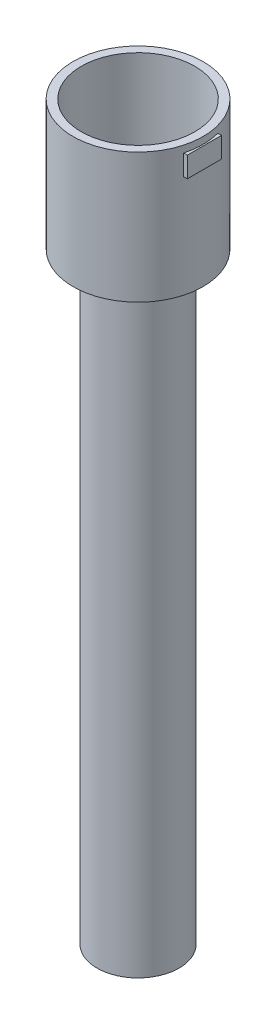
ISO-10303-21;
HEADER;
FILE_DESCRIPTION(('STEP AP214'),'2;1');
FILE_NAME('part.step','',(''),(''),'','','');
FILE_SCHEMA(('AUTOMOTIVE_DESIGN { 1 0 10303 214 1 1 1 1 }'));
ENDSEC;
DATA;
#1=APPLICATION_CONTEXT('core data for automotive mechanical design processes');
#2=APPLICATION_PROTOCOL_DEFINITION('international standard','automotive_design',2000,#1);
#3=PRODUCT_CONTEXT('',#1,'mechanical');
#4=PRODUCT('Part','Part','',(#3));
#5=PRODUCT_RELATED_PRODUCT_CATEGORY('part','',(#4));
#6=PRODUCT_DEFINITION_FORMATION('','',#4);
#7=PRODUCT_DEFINITION_CONTEXT('part definition',#1,'design');
#8=PRODUCT_DEFINITION('design','',#6,#7);
#9=PRODUCT_DEFINITION_SHAPE('','',#8);
#10=(LENGTH_UNIT() NAMED_UNIT(*) SI_UNIT(.MILLI.,.METRE.));
#11=(NAMED_UNIT(*) PLANE_ANGLE_UNIT() SI_UNIT($,.RADIAN.));
#12=(NAMED_UNIT(*) SI_UNIT($,.STERADIAN.) SOLID_ANGLE_UNIT());
#13=UNCERTAINTY_MEASURE_WITH_UNIT(LENGTH_MEASURE(1.E-05),#10,'distance_accuracy_value','');
#14=(GEOMETRIC_REPRESENTATION_CONTEXT(3) GLOBAL_UNCERTAINTY_ASSIGNED_CONTEXT((#13)) GLOBAL_UNIT_ASSIGNED_CONTEXT((#10,
#11,#12)) REPRESENTATION_CONTEXT('',''));
#15=CARTESIAN_POINT('',(0.,0.,0.));
#16=DIRECTION('',(0.,0.,1.));
#17=DIRECTION('',(1.,0.,0.));
#18=AXIS2_PLACEMENT_3D('',#15,#16,#17);
#19=CARTESIAN_POINT('',(0.,0.,0.));
#20=DIRECTION('',(0.,-1.,0.));
#21=DIRECTION('',(0.,0.,-1.));
#22=AXIS2_PLACEMENT_3D('',#19,#20,#21);
#23=PLANE('',#22);
#24=CARTESIAN_POINT('',(0.,0.,0.));
#25=DIRECTION('',(0.,-1.,0.));
#26=DIRECTION('',(0.,0.,-1.));
#27=AXIS2_PLACEMENT_3D('',#24,#25,#26);
#28=CIRCLE('',#27,6.);
#29=CARTESIAN_POINT('',(0.,0.,-6.));
#30=VERTEX_POINT('',#29);
#31=EDGE_CURVE('E11',#30,#30,#28,.T.);
#32=ORIENTED_EDGE('',*,*,#31,.T.);
#33=EDGE_LOOP('',(#32));
#34=FACE_BOUND('',#33,.T.);
#35=ADVANCED_FACE('F39',(#34),#23,.T.);
#36=CARTESIAN_POINT('',(0.,0.,0.));
#37=DIRECTION('',(0.,-1.,0.));
#38=DIRECTION('',(0.,0.,-1.));
#39=AXIS2_PLACEMENT_3D('',#36,#37,#38);
#40=CYLINDRICAL_SURFACE('',#39,6.);
#41=CARTESIAN_POINT('',(0.,88.,0.));
#42=DIRECTION('',(0.,-1.,0.));
#43=DIRECTION('',(0.,0.,-1.));
#44=AXIS2_PLACEMENT_3D('',#41,#42,#43);
#45=CIRCLE('',#44,6.);
#46=CARTESIAN_POINT('',(0.,88.,-6.));
#47=VERTEX_POINT('',#46);
#48=EDGE_CURVE('E46',#47,#47,#45,.T.);
#49=ORIENTED_EDGE('',*,*,#48,.T.);
#50=EDGE_LOOP('',(#49));
#51=FACE_BOUND('',#50,.T.);
#52=ORIENTED_EDGE('',*,*,#31,.F.);
#53=EDGE_LOOP('',(#52));
#54=FACE_BOUND('',#53,.T.);
#55=ADVANCED_FACE('F167',(#51,#54),#40,.T.);
#56=CARTESIAN_POINT('',(6.,88.,0.));
#57=DIRECTION('',(0.,-1.,0.));
#58=DIRECTION('',(0.,0.,-1.));
#59=AXIS2_PLACEMENT_3D('',#56,#57,#58);
#60=PLANE('',#59);
#61=CARTESIAN_POINT('',(0.,88.,0.));
#62=DIRECTION('',(0.,-1.,0.));
#63=DIRECTION('',(0.,0.,-1.));
#64=AXIS2_PLACEMENT_3D('',#61,#62,#63);
#65=CIRCLE('',#64,9.5);
#66=CARTESIAN_POINT('',(0.,88.,-9.5));
#67=VERTEX_POINT('',#66);
#68=EDGE_CURVE('E162',#67,#67,#65,.T.);
#69=ORIENTED_EDGE('',*,*,#68,.T.);
#70=EDGE_LOOP('',(#69));
#71=FACE_BOUND('',#70,.T.);
#72=ORIENTED_EDGE('',*,*,#48,.F.);
#73=EDGE_LOOP('',(#72));
#74=FACE_BOUND('',#73,.T.);
#75=ADVANCED_FACE('F170',(#71,#74),#60,.T.);
#76=CARTESIAN_POINT('',(0.,0.,0.));
#77=DIRECTION('',(0.,-1.,0.));
#78=DIRECTION('',(0.,0.,-1.));
#79=AXIS2_PLACEMENT_3D('',#76,#77,#78);
#80=CYLINDRICAL_SURFACE('',#79,9.5);
#81=DIRECTION('',(0.,-1.,0.));
#82=VECTOR('',#81,1.);
#83=CARTESIAN_POINT('',(-9.16515138991168,0.,2.5));
#84=LINE('',#83,#82);
#85=CARTESIAN_POINT('',(-9.16515138991168,103.,2.5));
#86=VERTEX_POINT('',#85);
#87=CARTESIAN_POINT('',(-9.16515138991168,106.,2.5));
#88=VERTEX_POINT('',#87);
#89=EDGE_CURVE('E144',#86,#88,#84,.F.);
#90=ORIENTED_EDGE('',*,*,#89,.F.);
#91=CARTESIAN_POINT('',(0.,103.,0.));
#92=DIRECTION('',(0.,1.,0.));
#93=DIRECTION('',(0.,0.,1.));
#94=AXIS2_PLACEMENT_3D('',#91,#92,#93);
#95=CIRCLE('',#94,9.5);
#96=CARTESIAN_POINT('',(-9.16515138991168,103.,-2.5));
#97=VERTEX_POINT('',#96);
#98=EDGE_CURVE('E111',#86,#97,#95,.F.);
#99=ORIENTED_EDGE('',*,*,#98,.T.);
#100=DIRECTION('',(0.,-1.,0.));
#101=VECTOR('',#100,1.);
#102=CARTESIAN_POINT('',(-9.16515138991168,0.,-2.5));
#103=LINE('',#102,#101);
#104=CARTESIAN_POINT('',(-9.16515138991168,106.,-2.5));
#105=VERTEX_POINT('',#104);
#106=EDGE_CURVE('E133',#97,#105,#103,.F.);
#107=ORIENTED_EDGE('',*,*,#106,.T.);
#108=CARTESIAN_POINT('',(0.,106.,0.));
#109=DIRECTION('',(0.,-1.,0.));
#110=DIRECTION('',(0.,0.,-1.));
#111=AXIS2_PLACEMENT_3D('',#108,#109,#110);
#112=CIRCLE('',#111,9.5);
#113=EDGE_CURVE('E149',#105,#88,#112,.F.);
#114=ORIENTED_EDGE('',*,*,#113,.T.);
#115=EDGE_LOOP('',(#90,#99,#107,#114));
#116=FACE_BOUND('',#115,.T.);
#117=DIRECTION('',(0.,-1.,0.));
#118=VECTOR('',#117,1.);
#119=CARTESIAN_POINT('',(9.16515138991168,0.,2.5));
#120=LINE('',#119,#118);
#121=CARTESIAN_POINT('',(9.16515138991168,106.,2.5));
#122=VERTEX_POINT('',#121);
#123=CARTESIAN_POINT('',(9.16515138991168,103.,2.5));
#124=VERTEX_POINT('',#123);
#125=EDGE_CURVE('E142',#122,#124,#120,.T.);
#126=ORIENTED_EDGE('',*,*,#125,.F.);
#127=CARTESIAN_POINT('',(9.16515138991168,106.,-2.5));
#128=VERTEX_POINT('',#127);
#129=EDGE_CURVE('E146',#122,#128,#112,.F.);
#130=ORIENTED_EDGE('',*,*,#129,.T.);
#131=DIRECTION('',(0.,-1.,0.));
#132=VECTOR('',#131,1.);
#133=CARTESIAN_POINT('',(9.16515138991168,0.,-2.5));
#134=LINE('',#133,#132);
#135=CARTESIAN_POINT('',(9.16515138991168,103.,-2.5));
#136=VERTEX_POINT('',#135);
#137=EDGE_CURVE('E129',#128,#136,#134,.T.);
#138=ORIENTED_EDGE('',*,*,#137,.T.);
#139=EDGE_CURVE('E150',#136,#124,#95,.F.);
#140=ORIENTED_EDGE('',*,*,#139,.T.);
#141=EDGE_LOOP('',(#126,#130,#138,#140));
#142=FACE_BOUND('',#141,.T.);
#143=CARTESIAN_POINT('',(0.,107.,0.));
#144=DIRECTION('',(0.,-1.,0.));
#145=DIRECTION('',(0.,0.,-1.));
#146=AXIS2_PLACEMENT_3D('',#143,#144,#145);
#147=CIRCLE('',#146,9.5);
#148=CARTESIAN_POINT('',(0.,107.,-9.5));
#149=VERTEX_POINT('',#148);
#150=EDGE_CURVE('E159',#149,#149,#147,.T.);
#151=ORIENTED_EDGE('',*,*,#150,.T.);
#152=EDGE_LOOP('',(#151));
#153=FACE_BOUND('',#152,.T.);
#154=ORIENTED_EDGE('',*,*,#68,.F.);
#155=EDGE_LOOP('',(#154));
#156=FACE_BOUND('',#155,.T.);
#157=ADVANCED_FACE('F172',(#116,#142,#153,#156),#80,.T.);
#158=CARTESIAN_POINT('',(9.5,107.,0.));
#159=DIRECTION('',(0.,1.,0.));
#160=DIRECTION('',(0.,0.,1.));
#161=AXIS2_PLACEMENT_3D('',#158,#159,#160);
#162=PLANE('',#161);
#163=CARTESIAN_POINT('',(0.,107.,0.));
#164=DIRECTION('',(0.,-1.,0.));
#165=DIRECTION('',(0.,0.,-1.));
#166=AXIS2_PLACEMENT_3D('',#163,#164,#165);
#167=CIRCLE('',#166,8.3);
#168=CARTESIAN_POINT('',(0.,107.,-8.3));
#169=VERTEX_POINT('',#168);
#170=EDGE_CURVE('E156',#169,#169,#167,.T.);
#171=ORIENTED_EDGE('',*,*,#170,.T.);
#172=EDGE_LOOP('',(#171));
#173=FACE_BOUND('',#172,.T.);
#174=ORIENTED_EDGE('',*,*,#150,.F.);
#175=EDGE_LOOP('',(#174));
#176=FACE_BOUND('',#175,.T.);
#177=ADVANCED_FACE('F179',(#173,#176),#162,.T.);
#178=CARTESIAN_POINT('',(0.,0.,0.));
#179=DIRECTION('',(0.,-1.,0.));
#180=DIRECTION('',(0.,0.,-1.));
#181=AXIS2_PLACEMENT_3D('',#178,#179,#180);
#182=CYLINDRICAL_SURFACE('',#181,8.3);
#183=CARTESIAN_POINT('',(0.,89.,0.));
#184=DIRECTION('',(0.,-1.,0.));
#185=DIRECTION('',(0.,0.,-1.));
#186=AXIS2_PLACEMENT_3D('',#183,#184,#185);
#187=CIRCLE('',#186,8.3);
#188=CARTESIAN_POINT('',(0.,89.,-8.3));
#189=VERTEX_POINT('',#188);
#190=EDGE_CURVE('E153',#189,#189,#187,.T.);
#191=ORIENTED_EDGE('',*,*,#190,.T.);
#192=EDGE_LOOP('',(#191));
#193=FACE_BOUND('',#192,.T.);
#194=ORIENTED_EDGE('',*,*,#170,.F.);
#195=EDGE_LOOP('',(#194));
#196=FACE_BOUND('',#195,.T.);
#197=ADVANCED_FACE('F207',(#193,#196),#182,.F.);
#198=CARTESIAN_POINT('',(8.3,89.,0.));
#199=DIRECTION('',(0.,1.,0.));
#200=DIRECTION('',(0.,0.,1.));
#201=AXIS2_PLACEMENT_3D('',#198,#199,#200);
#202=PLANE('',#201);
#203=ORIENTED_EDGE('',*,*,#190,.F.);
#204=EDGE_LOOP('',(#203));
#205=FACE_BOUND('',#204,.T.);
#206=ADVANCED_FACE('F216',(#205),#202,.T.);
#207=CARTESIAN_POINT('',(9.7,103.,2.5));
#208=DIRECTION('',(-1.,0.,0.));
#209=DIRECTION('',(0.,0.,1.));
#210=AXIS2_PLACEMENT_3D('',#207,#208,#209);
#211=PLANE('',#210);
#212=DIRECTION('',(0.,1.,0.));
#213=VECTOR('',#212,1.);
#214=CARTESIAN_POINT('',(9.7,103.,-2.5));
#215=LINE('',#214,#213);
#216=CARTESIAN_POINT('',(9.7,103.,-2.5));
#217=VERTEX_POINT('',#216);
#218=CARTESIAN_POINT('',(9.7,106.,-2.5));
#219=VERTEX_POINT('',#218);
#220=EDGE_CURVE('E371',#217,#219,#215,.T.);
#221=ORIENTED_EDGE('',*,*,#220,.T.);
#222=DIRECTION('',(0.,0.,-1.));
#223=VECTOR('',#222,1.);
#224=CARTESIAN_POINT('',(9.7,106.,2.5));
#225=LINE('',#224,#223);
#226=CARTESIAN_POINT('',(9.7,106.,2.5));
#227=VERTEX_POINT('',#226);
#228=EDGE_CURVE('E136',#227,#219,#225,.T.);
#229=ORIENTED_EDGE('',*,*,#228,.F.);
#230=DIRECTION('',(0.,1.,0.));
#231=VECTOR('',#230,1.);
#232=CARTESIAN_POINT('',(9.7,103.,2.5));
#233=LINE('',#232,#231);
#234=CARTESIAN_POINT('',(9.7,103.,2.5));
#235=VERTEX_POINT('',#234);
#236=EDGE_CURVE('E114',#235,#227,#233,.T.);
#237=ORIENTED_EDGE('',*,*,#236,.F.);
#238=DIRECTION('',(0.,0.,-1.));
#239=VECTOR('',#238,1.);
#240=CARTESIAN_POINT('',(9.7,103.,2.5));
#241=LINE('',#240,#239);
#242=EDGE_CURVE('E130',#235,#217,#241,.T.);
#243=ORIENTED_EDGE('',*,*,#242,.T.);
#244=EDGE_LOOP('',(#221,#229,#237,#243));
#245=FACE_BOUND('',#244,.T.);
#246=ADVANCED_FACE('F221',(#245),#211,.F.);
#247=CARTESIAN_POINT('',(0.,0.,-2.5));
#248=DIRECTION('',(0.,0.,1.));
#249=DIRECTION('',(1.,0.,0.));
#250=AXIS2_PLACEMENT_3D('',#247,#248,#249);
#251=PLANE('',#250);
#252=ORIENTED_EDGE('',*,*,#137,.F.);
#253=DIRECTION('',(-1.,0.,0.));
#254=VECTOR('',#253,1.);
#255=CARTESIAN_POINT('',(9.7,106.,-2.5));
#256=LINE('',#255,#254);
#257=EDGE_CURVE('E125',#219,#128,#256,.T.);
#258=ORIENTED_EDGE('',*,*,#257,.F.);
#259=ORIENTED_EDGE('',*,*,#220,.F.);
#260=DIRECTION('',(1.,0.,0.));
#261=VECTOR('',#260,1.);
#262=CARTESIAN_POINT('',(-9.7,103.,-2.5));
#263=LINE('',#262,#261);
#264=EDGE_CURVE('E61',#136,#217,#263,.T.);
#265=ORIENTED_EDGE('',*,*,#264,.F.);
#266=EDGE_LOOP('',(#252,#258,#259,#265));
#267=FACE_BOUND('',#266,.T.);
#268=ADVANCED_FACE('F238',(#267),#251,.F.);
#269=CARTESIAN_POINT('',(0.,0.,2.5));
#270=DIRECTION('',(0.,0.,1.));
#271=DIRECTION('',(1.,0.,0.));
#272=AXIS2_PLACEMENT_3D('',#269,#270,#271);
#273=PLANE('',#272);
#274=DIRECTION('',(-1.,0.,0.));
#275=VECTOR('',#274,1.);
#276=CARTESIAN_POINT('',(9.7,106.,2.5));
#277=LINE('',#276,#275);
#278=EDGE_CURVE('E375',#227,#122,#277,.T.);
#279=ORIENTED_EDGE('',*,*,#278,.T.);
#280=ORIENTED_EDGE('',*,*,#125,.T.);
#281=DIRECTION('',(1.,0.,0.));
#282=VECTOR('',#281,1.);
#283=CARTESIAN_POINT('',(-9.7,103.,2.5));
#284=LINE('',#283,#282);
#285=EDGE_CURVE('E115',#124,#235,#284,.T.);
#286=ORIENTED_EDGE('',*,*,#285,.T.);
#287=ORIENTED_EDGE('',*,*,#236,.T.);
#288=EDGE_LOOP('',(#279,#280,#286,#287));
#289=FACE_BOUND('',#288,.T.);
#290=ADVANCED_FACE('F249',(#289),#273,.T.);
#291=CARTESIAN_POINT('',(9.7,106.,2.5));
#292=DIRECTION('',(0.,-1.,0.));
#293=DIRECTION('',(0.,0.,-1.));
#294=AXIS2_PLACEMENT_3D('',#291,#292,#293);
#295=PLANE('',#294);
#296=ORIENTED_EDGE('',*,*,#129,.F.);
#297=ORIENTED_EDGE('',*,*,#278,.F.);
#298=ORIENTED_EDGE('',*,*,#228,.T.);
#299=ORIENTED_EDGE('',*,*,#257,.T.);
#300=EDGE_LOOP('',(#296,#297,#298,#299));
#301=FACE_BOUND('',#300,.T.);
#302=ADVANCED_FACE('F260',(#301),#295,.F.);
#303=CARTESIAN_POINT('',(-9.7,103.,2.5));
#304=DIRECTION('',(0.,1.,0.));
#305=DIRECTION('',(0.,0.,1.));
#306=AXIS2_PLACEMENT_3D('',#303,#304,#305);
#307=PLANE('',#306);
#308=ORIENTED_EDGE('',*,*,#139,.F.);
#309=ORIENTED_EDGE('',*,*,#264,.T.);
#310=ORIENTED_EDGE('',*,*,#242,.F.);
#311=ORIENTED_EDGE('',*,*,#285,.F.);
#312=EDGE_LOOP('',(#308,#309,#310,#311));
#313=FACE_BOUND('',#312,.T.);
#314=ADVANCED_FACE('F271',(#313),#307,.F.);
#315=ORIENTED_EDGE('',*,*,#98,.F.);
#316=CARTESIAN_POINT('',(-9.7,103.,2.5));
#317=VERTEX_POINT('',#316);
#318=EDGE_CURVE('E103',#317,#86,#284,.T.);
#319=ORIENTED_EDGE('',*,*,#318,.F.);
#320=DIRECTION('',(0.,0.,-1.));
#321=VECTOR('',#320,1.);
#322=CARTESIAN_POINT('',(-9.7,103.,2.5));
#323=LINE('',#322,#321);
#324=CARTESIAN_POINT('',(-9.7,103.,-2.5));
#325=VERTEX_POINT('',#324);
#326=EDGE_CURVE('E108',#317,#325,#323,.T.);
#327=ORIENTED_EDGE('',*,*,#326,.T.);
#328=EDGE_CURVE('E369',#325,#97,#263,.T.);
#329=ORIENTED_EDGE('',*,*,#328,.T.);
#330=EDGE_LOOP('',(#315,#319,#327,#329));
#331=FACE_BOUND('',#330,.T.);
#332=ADVANCED_FACE('F105',(#331),#307,.F.);
#333=ORIENTED_EDGE('',*,*,#113,.F.);
#334=CARTESIAN_POINT('',(-9.7,106.,-2.5));
#335=VERTEX_POINT('',#334);
#336=EDGE_CURVE('E53',#105,#335,#256,.T.);
#337=ORIENTED_EDGE('',*,*,#336,.T.);
#338=DIRECTION('',(0.,0.,-1.));
#339=VECTOR('',#338,1.);
#340=CARTESIAN_POINT('',(-9.7,106.,2.5));
#341=LINE('',#340,#339);
#342=CARTESIAN_POINT('',(-9.7,106.,2.5));
#343=VERTEX_POINT('',#342);
#344=EDGE_CURVE('E374',#343,#335,#341,.T.);
#345=ORIENTED_EDGE('',*,*,#344,.F.);
#346=EDGE_CURVE('E121',#88,#343,#277,.T.);
#347=ORIENTED_EDGE('',*,*,#346,.F.);
#348=EDGE_LOOP('',(#333,#337,#345,#347));
#349=FACE_BOUND('',#348,.T.);
#350=ADVANCED_FACE('F274',(#349),#295,.F.);
#351=ORIENTED_EDGE('',*,*,#318,.T.);
#352=ORIENTED_EDGE('',*,*,#89,.T.);
#353=ORIENTED_EDGE('',*,*,#346,.T.);
#354=DIRECTION('',(0.,-1.,0.));
#355=VECTOR('',#354,1.);
#356=CARTESIAN_POINT('',(-9.7,106.,2.5));
#357=LINE('',#356,#355);
#358=EDGE_CURVE('E118',#343,#317,#357,.T.);
#359=ORIENTED_EDGE('',*,*,#358,.T.);
#360=EDGE_LOOP('',(#351,#352,#353,#359));
#361=FACE_BOUND('',#360,.T.);
#362=ADVANCED_FACE('F119',(#361),#273,.T.);
#363=ORIENTED_EDGE('',*,*,#106,.F.);
#364=ORIENTED_EDGE('',*,*,#328,.F.);
#365=DIRECTION('',(0.,-1.,0.));
#366=VECTOR('',#365,1.);
#367=CARTESIAN_POINT('',(-9.7,106.,-2.5));
#368=LINE('',#367,#366);
#369=EDGE_CURVE('E128',#335,#325,#368,.T.);
#370=ORIENTED_EDGE('',*,*,#369,.F.);
#371=ORIENTED_EDGE('',*,*,#336,.F.);
#372=EDGE_LOOP('',(#363,#364,#370,#371));
#373=FACE_BOUND('',#372,.T.);
#374=ADVANCED_FACE('F251',(#373),#251,.F.);
#375=CARTESIAN_POINT('',(-9.7,106.,2.5));
#376=DIRECTION('',(1.,0.,0.));
#377=DIRECTION('',(0.,0.,-1.));
#378=AXIS2_PLACEMENT_3D('',#375,#376,#377);
#379=PLANE('',#378);
#380=ORIENTED_EDGE('',*,*,#369,.T.);
#381=ORIENTED_EDGE('',*,*,#326,.F.);
#382=ORIENTED_EDGE('',*,*,#358,.F.);
#383=ORIENTED_EDGE('',*,*,#344,.T.);
#384=EDGE_LOOP('',(#380,#381,#382,#383));
#385=FACE_BOUND('',#384,.T.);
#386=ADVANCED_FACE('F127',(#385),#379,.F.);
#387=CLOSED_SHELL('',(#35,#55,#75,#157,#177,#197,#206,#246,#268,#290,#302,#314,#332,#350,#362,
#374,#386));
#388=MANIFOLD_SOLID_BREP('B2',#387);
#389=ADVANCED_BREP_SHAPE_REPRESENTATION('',(#18,#388),#14);
#390=SHAPE_DEFINITION_REPRESENTATION(#9,#389);
ENDSEC;
END-ISO-10303-21;
